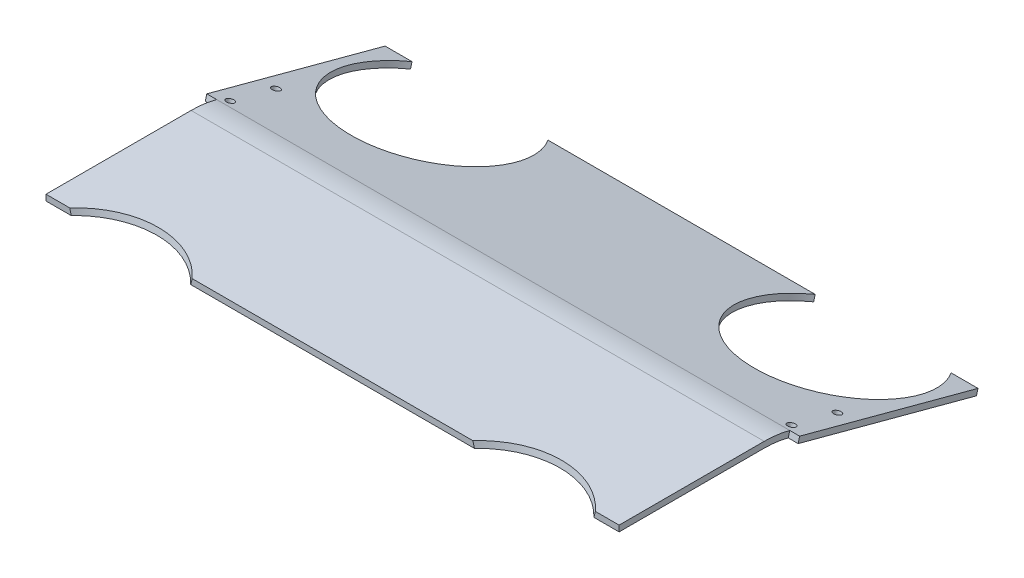
ISO-10303-21;
HEADER;
FILE_DESCRIPTION(('STEP AP214'),'2;1');
FILE_NAME('part.step','',(''),(''),'','','');
FILE_SCHEMA(('AUTOMOTIVE_DESIGN { 1 0 10303 214 1 1 1 1 }'));
ENDSEC;
DATA;
#1=APPLICATION_CONTEXT('core data for automotive mechanical design processes');
#2=APPLICATION_PROTOCOL_DEFINITION('international standard','automotive_design',2000,#1);
#3=PRODUCT_CONTEXT('',#1,'mechanical');
#4=PRODUCT('Part','Part','',(#3));
#5=PRODUCT_RELATED_PRODUCT_CATEGORY('part','',(#4));
#6=PRODUCT_DEFINITION_FORMATION('','',#4);
#7=PRODUCT_DEFINITION_CONTEXT('part definition',#1,'design');
#8=PRODUCT_DEFINITION('design','',#6,#7);
#9=PRODUCT_DEFINITION_SHAPE('','',#8);
#10=(LENGTH_UNIT() NAMED_UNIT(*) SI_UNIT(.MILLI.,.METRE.));
#11=(NAMED_UNIT(*) PLANE_ANGLE_UNIT() SI_UNIT($,.RADIAN.));
#12=(NAMED_UNIT(*) SI_UNIT($,.STERADIAN.) SOLID_ANGLE_UNIT());
#13=UNCERTAINTY_MEASURE_WITH_UNIT(LENGTH_MEASURE(1.E-05),#10,'distance_accuracy_value','');
#14=(GEOMETRIC_REPRESENTATION_CONTEXT(3) GLOBAL_UNCERTAINTY_ASSIGNED_CONTEXT((#13)) GLOBAL_UNIT_ASSIGNED_CONTEXT((#10,
#11,#12)) REPRESENTATION_CONTEXT('',''));
#15=CARTESIAN_POINT('',(0.,0.,0.));
#16=DIRECTION('',(0.,0.,1.));
#17=DIRECTION('',(1.,0.,0.));
#18=AXIS2_PLACEMENT_3D('',#15,#16,#17);
#19=CARTESIAN_POINT('',(300.,0.,0.));
#20=DIRECTION('',(0.,0.,-1.));
#21=DIRECTION('',(-1.,0.,0.));
#22=AXIS2_PLACEMENT_3D('',#19,#20,#21);
#23=PLANE('',#22);
#24=DIRECTION('',(-1.,0.,0.));
#25=VECTOR('',#24,1.);
#26=CARTESIAN_POINT('',(300.,0.,0.));
#27=LINE('',#26,#25);
#28=CARTESIAN_POINT('',(221.010392932059,0.,0.));
#29=VERTEX_POINT('',#28);
#30=CARTESIAN_POINT('',(78.9896070679405,0.,0.));
#31=VERTEX_POINT('',#30);
#32=EDGE_CURVE('E229',#29,#31,#27,.T.);
#33=ORIENTED_EDGE('',*,*,#32,.T.);
#34=CARTESIAN_POINT('',(48.,112.372956407092,0.));
#35=DIRECTION('',(0.,0.,-1.));
#36=DIRECTION('',(0.,1.,0.));
#37=AXIS2_PLACEMENT_3D('',#34,#35,#36);
#38=ELLIPSE('',#37,164.207390469141,42.5);
#39=CARTESIAN_POINT('',(78.242147677733,-3.,0.));
#40=VERTEX_POINT('',#39);
#41=EDGE_CURVE('E237',#31,#40,#38,.T.);
#42=ORIENTED_EDGE('',*,*,#41,.T.);
#43=DIRECTION('',(-1.,0.,0.));
#44=VECTOR('',#43,1.);
#45=CARTESIAN_POINT('',(300.,-3.,0.));
#46=LINE('',#45,#44);
#47=CARTESIAN_POINT('',(221.757852322267,-3.,0.));
#48=VERTEX_POINT('',#47);
#49=EDGE_CURVE('E213',#48,#40,#46,.T.);
#50=ORIENTED_EDGE('',*,*,#49,.F.);
#51=CARTESIAN_POINT('',(252.,112.372956407092,0.));
#52=DIRECTION('',(0.,0.,-1.));
#53=DIRECTION('',(0.,1.,0.));
#54=AXIS2_PLACEMENT_3D('',#51,#52,#53);
#55=ELLIPSE('',#54,164.207390469141,42.5);
#56=EDGE_CURVE('E239',#48,#29,#55,.T.);
#57=ORIENTED_EDGE('',*,*,#56,.T.);
#58=EDGE_LOOP('',(#33,#42,#50,#57));
#59=FACE_BOUND('',#58,.T.);
#60=ADVANCED_FACE('F38',(#59),#23,.F.);
#61=CARTESIAN_POINT('',(295.,-3.,0.));
#62=VERTEX_POINT('',#61);
#63=CARTESIAN_POINT('',(282.242147677733,-3.,0.));
#64=VERTEX_POINT('',#63);
#65=EDGE_CURVE('E214',#62,#64,#46,.T.);
#66=ORIENTED_EDGE('',*,*,#65,.F.);
#67=DIRECTION('',(0.,1.,0.));
#68=VECTOR('',#67,1.);
#69=CARTESIAN_POINT('',(295.,0.,0.));
#70=LINE('',#69,#68);
#71=CARTESIAN_POINT('',(295.,0.,0.));
#72=VERTEX_POINT('',#71);
#73=EDGE_CURVE('E280',#62,#72,#70,.T.);
#74=ORIENTED_EDGE('',*,*,#73,.T.);
#75=CARTESIAN_POINT('',(282.98960706794,0.,0.));
#76=VERTEX_POINT('',#75);
#77=EDGE_CURVE('E240',#72,#76,#27,.T.);
#78=ORIENTED_EDGE('',*,*,#77,.T.);
#79=EDGE_CURVE('E300',#76,#64,#55,.T.);
#80=ORIENTED_EDGE('',*,*,#79,.T.);
#81=EDGE_LOOP('',(#66,#74,#78,#80));
#82=FACE_BOUND('',#81,.T.);
#83=ADVANCED_FACE('F390',(#82),#23,.F.);
#84=CARTESIAN_POINT('',(300.,-25.8819045102521,-176.592582628907));
#85=DIRECTION('',(0.,0.258819045102508,0.965925826289072));
#86=DIRECTION('',(0.,-0.965925826289072,0.258819045102508));
#87=AXIS2_PLACEMENT_3D('',#84,#85,#86);
#88=PLANE('',#87);
#89=DIRECTION('',(-1.,0.,0.));
#90=VECTOR('',#89,1.);
#91=CARTESIAN_POINT('',(300.,-28.7796819891194,-175.816125493599));
#92=LINE('',#91,#90);
#93=CARTESIAN_POINT('',(300.,-28.7796819891194,-175.816125493599));
#94=VERTEX_POINT('',#93);
#95=CARTESIAN_POINT('',(286.369317712169,-28.7796819891194,-175.816125493599));
#96=VERTEX_POINT('',#95);
#97=EDGE_CURVE('E201',#94,#96,#92,.T.);
#98=ORIENTED_EDGE('',*,*,#97,.T.);
#99=DIRECTION('',(0.,0.965925826289068,-0.258819045102522));
#100=VECTOR('',#99,1.);
#101=CARTESIAN_POINT('',(286.369317712168,-72.7337133625192,-164.038678283005));
#102=LINE('',#101,#100);
#103=CARTESIAN_POINT('',(286.369317712169,-25.8819045102522,-176.592582628907));
#104=VERTEX_POINT('',#103);
#105=EDGE_CURVE('E252',#96,#104,#102,.T.);
#106=ORIENTED_EDGE('',*,*,#105,.T.);
#107=DIRECTION('',(-1.,0.,0.));
#108=VECTOR('',#107,1.);
#109=CARTESIAN_POINT('',(300.,-25.8819045102521,-176.592582628907));
#110=LINE('',#109,#108);
#111=CARTESIAN_POINT('',(300.,-25.8819045102521,-176.592582628907));
#112=VERTEX_POINT('',#111);
#113=EDGE_CURVE('E195',#112,#104,#110,.T.);
#114=ORIENTED_EDGE('',*,*,#113,.F.);
#115=DIRECTION('',(0.,0.965925826289072,-0.258819045102508));
#116=VECTOR('',#115,1.);
#117=CARTESIAN_POINT('',(300.,-25.8819045102521,-176.592582628907));
#118=LINE('',#117,#116);
#119=EDGE_CURVE('E180',#94,#112,#118,.T.);
#120=ORIENTED_EDGE('',*,*,#119,.F.);
#121=EDGE_LOOP('',(#98,#106,#114,#120));
#122=FACE_BOUND('',#121,.T.);
#123=ADVANCED_FACE('F382',(#122),#88,.F.);
#124=CARTESIAN_POINT('',(217.630682287831,-25.8819045102521,-176.592582628907));
#125=VERTEX_POINT('',#124);
#126=CARTESIAN_POINT('',(82.3693177121688,-25.8819045102522,-176.592582628907));
#127=VERTEX_POINT('',#126);
#128=EDGE_CURVE('E193',#125,#127,#110,.T.);
#129=ORIENTED_EDGE('',*,*,#128,.F.);
#130=DIRECTION('',(0.,0.965925826289068,-0.258819045102522));
#131=VECTOR('',#130,1.);
#132=CARTESIAN_POINT('',(217.630682287832,-72.7337133625192,-164.038678283005));
#133=LINE('',#132,#131);
#134=CARTESIAN_POINT('',(217.630682287832,-28.7796819891194,-175.8161254936));
#135=VERTEX_POINT('',#134);
#136=EDGE_CURVE('E60',#125,#135,#133,.F.);
#137=ORIENTED_EDGE('',*,*,#136,.T.);
#138=CARTESIAN_POINT('',(82.3693177121688,-28.7796819891194,-175.816125493599));
#139=VERTEX_POINT('',#138);
#140=EDGE_CURVE('E205',#135,#139,#92,.T.);
#141=ORIENTED_EDGE('',*,*,#140,.T.);
#142=DIRECTION('',(0.,0.965925826289068,-0.258819045102522));
#143=VECTOR('',#142,1.);
#144=CARTESIAN_POINT('',(82.3693177121683,-72.7337133625192,-164.038678283005));
#145=LINE('',#144,#143);
#146=EDGE_CURVE('E262',#139,#127,#145,.T.);
#147=ORIENTED_EDGE('',*,*,#146,.T.);
#148=EDGE_LOOP('',(#129,#137,#141,#147));
#149=FACE_BOUND('',#148,.T.);
#150=ADVANCED_FACE('F380',(#149),#88,.F.);
#151=CARTESIAN_POINT('',(17.7578523222671,-3.,0.));
#152=VERTEX_POINT('',#151);
#153=CARTESIAN_POINT('',(5.,-3.,0.));
#154=VERTEX_POINT('',#153);
#155=EDGE_CURVE('E210',#152,#154,#46,.T.);
#156=ORIENTED_EDGE('',*,*,#155,.F.);
#157=CARTESIAN_POINT('',(17.0103929320596,0.,0.));
#158=VERTEX_POINT('',#157);
#159=EDGE_CURVE('E272',#152,#158,#38,.T.);
#160=ORIENTED_EDGE('',*,*,#159,.T.);
#161=CARTESIAN_POINT('',(5.,0.,0.));
#162=VERTEX_POINT('',#161);
#163=EDGE_CURVE('E184',#158,#162,#27,.T.);
#164=ORIENTED_EDGE('',*,*,#163,.T.);
#165=DIRECTION('',(0.,-1.,0.));
#166=VECTOR('',#165,1.);
#167=CARTESIAN_POINT('',(5.,0.,0.));
#168=LINE('',#167,#166);
#169=EDGE_CURVE('E291',#162,#154,#168,.T.);
#170=ORIENTED_EDGE('',*,*,#169,.T.);
#171=EDGE_LOOP('',(#156,#160,#164,#170));
#172=FACE_BOUND('',#171,.T.);
#173=ADVANCED_FACE('F40',(#172),#23,.F.);
#174=CARTESIAN_POINT('',(300.,-3.,0.));
#175=DIRECTION('',(0.,1.,0.));
#176=DIRECTION('',(0.,0.,1.));
#177=AXIS2_PLACEMENT_3D('',#174,#175,#176);
#178=PLANE('',#177);
#179=ORIENTED_EDGE('',*,*,#49,.T.);
#180=CARTESIAN_POINT('',(48.,-3.,30.9140904976715));
#181=DIRECTION('',(0.,1.,0.));
#182=DIRECTION('',(0.,0.,-1.));
#183=AXIS2_PLACEMENT_3D('',#180,#181,#182);
#184=ELLIPSE('',#183,43.9992376674285,42.5);
#185=EDGE_CURVE('E269',#40,#152,#184,.T.);
#186=ORIENTED_EDGE('',*,*,#185,.T.);
#187=ORIENTED_EDGE('',*,*,#155,.T.);
#188=DIRECTION('',(0.,0.,-1.));
#189=VECTOR('',#188,1.);
#190=CARTESIAN_POINT('',(5.,-3.,0.));
#191=LINE('',#190,#189);
#192=CARTESIAN_POINT('',(5.,-3.,-73.4173751206302));
#193=VERTEX_POINT('',#192);
#194=EDGE_CURVE('E288',#154,#193,#191,.T.);
#195=ORIENTED_EDGE('',*,*,#194,.T.);
#196=DIRECTION('',(-1.,0.,0.));
#197=VECTOR('',#196,1.);
#198=CARTESIAN_POINT('',(300.,-3.00000000000001,-73.4173751206302));
#199=LINE('',#198,#197);
#200=CARTESIAN_POINT('',(295.,-3.,-73.4173751206302));
#201=VERTEX_POINT('',#200);
#202=EDGE_CURVE('E207',#201,#193,#199,.T.);
#203=ORIENTED_EDGE('',*,*,#202,.F.);
#204=DIRECTION('',(0.,0.,1.));
#205=VECTOR('',#204,1.);
#206=CARTESIAN_POINT('',(295.,-3.,0.));
#207=LINE('',#206,#205);
#208=EDGE_CURVE('E277',#201,#62,#207,.T.);
#209=ORIENTED_EDGE('',*,*,#208,.T.);
#210=ORIENTED_EDGE('',*,*,#65,.T.);
#211=CARTESIAN_POINT('',(252.,-3.,30.9140904976715));
#212=DIRECTION('',(0.,1.,0.));
#213=DIRECTION('',(0.,0.,-1.));
#214=AXIS2_PLACEMENT_3D('',#211,#212,#213);
#215=ELLIPSE('',#214,43.9992376674285,42.5);
#216=EDGE_CURVE('E297',#64,#48,#215,.T.);
#217=ORIENTED_EDGE('',*,*,#216,.T.);
#218=EDGE_LOOP('',(#179,#186,#187,#195,#203,#209,#210,#217));
#219=FACE_BOUND('',#218,.T.);
#220=ADVANCED_FACE('F388',(#219),#178,.F.);
#221=CARTESIAN_POINT('',(300.,-50.,-73.4173751206302));
#222=DIRECTION('',(-1.,0.,0.));
#223=DIRECTION('',(0.,0.,1.));
#224=AXIS2_PLACEMENT_3D('',#221,#222,#223);
#225=CYLINDRICAL_SURFACE('',#224,47.);
#226=DIRECTION('',(-1.,0.,0.));
#227=VECTOR('',#226,1.);
#228=CARTESIAN_POINT('',(300.,-4.60148616441381,-85.5818702404487));
#229=LINE('',#228,#227);
#230=CARTESIAN_POINT('',(295.,-4.60148616441382,-85.5818702404487));
#231=VERTEX_POINT('',#230);
#232=CARTESIAN_POINT('',(5.,-4.60148616441381,-85.5818702404487));
#233=VERTEX_POINT('',#232);
#234=EDGE_CURVE('E204',#231,#233,#229,.T.);
#235=ORIENTED_EDGE('',*,*,#234,.F.);
#236=CARTESIAN_POINT('',(295.,-50.,-73.4173751206302));
#237=DIRECTION('',(-1.,0.,0.));
#238=DIRECTION('',(0.,0.,1.));
#239=AXIS2_PLACEMENT_3D('',#236,#237,#238);
#240=CIRCLE('',#239,47.);
#241=EDGE_CURVE('E274',#231,#201,#240,.F.);
#242=ORIENTED_EDGE('',*,*,#241,.T.);
#243=ORIENTED_EDGE('',*,*,#202,.T.);
#244=CARTESIAN_POINT('',(5.,-50.,-73.4173751206302));
#245=DIRECTION('',(1.,0.,0.));
#246=DIRECTION('',(0.,0.,-1.));
#247=AXIS2_PLACEMENT_3D('',#244,#245,#246);
#248=CIRCLE('',#247,47.);
#249=EDGE_CURVE('E285',#193,#233,#248,.F.);
#250=ORIENTED_EDGE('',*,*,#249,.T.);
#251=EDGE_LOOP('',(#235,#242,#243,#250));
#252=FACE_BOUND('',#251,.T.);
#253=ADVANCED_FACE('F360',(#252),#225,.F.);
#254=CARTESIAN_POINT('',(300.,-4.60148616441381,-85.5818702404487));
#255=DIRECTION('',(0.,0.965925826289068,-0.258819045102521));
#256=DIRECTION('',(0.,0.258819045102521,0.965925826289068));
#257=AXIS2_PLACEMENT_3D('',#254,#255,#256);
#258=PLANE('',#257);
#259=CARTESIAN_POINT('',(8.00000000000001,-11.8484194272844,-112.627793376543));
#260=DIRECTION('',(0.,0.965925826289068,-0.258819045102521));
#261=DIRECTION('',(0.,0.258819045102521,0.965925826289068));
#262=AXIS2_PLACEMENT_3D('',#259,#260,#261);
#263=CIRCLE('',#262,2.);
#264=CARTESIAN_POINT('',(8.00000000000001,-11.3307813370794,-110.695941723964));
#265=VERTEX_POINT('',#264);
#266=EDGE_CURVE('E314',#265,#265,#263,.T.);
#267=ORIENTED_EDGE('',*,*,#266,.T.);
#268=EDGE_LOOP('',(#267));
#269=FACE_BOUND('',#268,.T.);
#270=CARTESIAN_POINT('',(292.,-5.6367623448239,-89.445573545605));
#271=DIRECTION('',(0.,0.965925826289068,-0.258819045102521));
#272=DIRECTION('',(0.,0.258819045102521,0.965925826289068));
#273=AXIS2_PLACEMENT_3D('',#270,#271,#272);
#274=CIRCLE('',#273,2.);
#275=CARTESIAN_POINT('',(292.,-5.11912425461886,-87.5137218930269));
#276=VERTEX_POINT('',#275);
#277=EDGE_CURVE('E317',#276,#276,#274,.T.);
#278=ORIENTED_EDGE('',*,*,#277,.T.);
#279=EDGE_LOOP('',(#278));
#280=FACE_BOUND('',#279,.T.);
#281=CARTESIAN_POINT('',(292.,-11.8484194272844,-112.627793376543));
#282=DIRECTION('',(0.,0.965925826289068,-0.258819045102521));
#283=DIRECTION('',(0.,0.258819045102521,0.965925826289068));
#284=AXIS2_PLACEMENT_3D('',#281,#282,#283);
#285=CIRCLE('',#284,2.);
#286=CARTESIAN_POINT('',(292.,-11.3307813370794,-110.695941723965));
#287=VERTEX_POINT('',#286);
#288=EDGE_CURVE('E320',#287,#287,#285,.T.);
#289=ORIENTED_EDGE('',*,*,#288,.T.);
#290=EDGE_LOOP('',(#289));
#291=FACE_BOUND('',#290,.T.);
#292=CARTESIAN_POINT('',(8.00000000000001,-5.63676234482389,-89.4455735456049));
#293=DIRECTION('',(0.,0.965925826289068,-0.258819045102521));
#294=DIRECTION('',(0.,0.258819045102521,0.965925826289068));
#295=AXIS2_PLACEMENT_3D('',#292,#293,#294);
#296=CIRCLE('',#295,2.);
#297=CARTESIAN_POINT('',(8.00000000000001,-5.11912425461885,-87.5137218930268));
#298=VERTEX_POINT('',#297);
#299=EDGE_CURVE('E323',#298,#298,#296,.T.);
#300=ORIENTED_EDGE('',*,*,#299,.T.);
#301=EDGE_LOOP('',(#300));
#302=FACE_BOUND('',#301,.T.);
#303=ORIENTED_EDGE('',*,*,#140,.F.);
#304=CARTESIAN_POINT('',(252.,-22.3092058615563,-151.667979836373));
#305=DIRECTION('',(0.,0.965925826289068,-0.258819045102521));
#306=DIRECTION('',(0.,0.258819045102521,0.965925826289068));
#307=AXIS2_PLACEMENT_3D('',#304,#305,#306);
#308=CIRCLE('',#307,42.5);
#309=EDGE_CURVE('E258',#135,#96,#308,.T.);
#310=ORIENTED_EDGE('',*,*,#309,.T.);
#311=ORIENTED_EDGE('',*,*,#97,.F.);
#312=DIRECTION('',(0.,-0.258819045102521,-0.965925826289068));
#313=VECTOR('',#312,1.);
#314=CARTESIAN_POINT('',(300.,-4.60148616441381,-85.5818702404487));
#315=LINE('',#314,#313);
#316=CARTESIAN_POINT('',(300.,-4.60148616441381,-85.5818702404487));
#317=VERTEX_POINT('',#316);
#318=EDGE_CURVE('E246',#317,#94,#315,.T.);
#319=ORIENTED_EDGE('',*,*,#318,.F.);
#320=EDGE_CURVE('E170',#317,#231,#229,.T.);
#321=ORIENTED_EDGE('',*,*,#320,.T.);
#322=ORIENTED_EDGE('',*,*,#234,.T.);
#323=DIRECTION('',(-1.,0.,0.));
#324=VECTOR('',#323,1.);
#325=CARTESIAN_POINT('',(300.,-4.60148616441381,-85.5818702404487));
#326=LINE('',#325,#324);
#327=CARTESIAN_POINT('',(0.,-4.6014861644138,-85.5818702404487));
#328=VERTEX_POINT('',#327);
#329=EDGE_CURVE('E302',#233,#328,#326,.T.);
#330=ORIENTED_EDGE('',*,*,#329,.T.);
#331=DIRECTION('',(0.,-0.258819045102521,-0.965925826289068));
#332=VECTOR('',#331,1.);
#333=CARTESIAN_POINT('',(0.,-4.60148616441381,-85.5818702404487));
#334=LINE('',#333,#332);
#335=CARTESIAN_POINT('',(0.,-28.7796819891194,-175.816125493599));
#336=VERTEX_POINT('',#335);
#337=EDGE_CURVE('E250',#328,#336,#334,.T.);
#338=ORIENTED_EDGE('',*,*,#337,.T.);
#339=CARTESIAN_POINT('',(13.6306822878317,-28.7796819891194,-175.8161254936));
#340=VERTEX_POINT('',#339);
#341=EDGE_CURVE('E200',#340,#336,#92,.T.);
#342=ORIENTED_EDGE('',*,*,#341,.F.);
#343=CARTESIAN_POINT('',(48.,-22.3092058615563,-151.667979836373));
#344=DIRECTION('',(0.,0.965925826289068,-0.258819045102521));
#345=DIRECTION('',(0.,0.258819045102521,0.965925826289068));
#346=AXIS2_PLACEMENT_3D('',#343,#344,#345);
#347=CIRCLE('',#346,42.5);
#348=EDGE_CURVE('E265',#340,#139,#347,.T.);
#349=ORIENTED_EDGE('',*,*,#348,.T.);
#350=EDGE_LOOP('',(#303,#310,#311,#319,#321,#322,#330,#338,#342,#349));
#351=FACE_BOUND('',#350,.T.);
#352=ADVANCED_FACE('F357',(#269,#280,#291,#302,#351),#258,.F.);
#353=CARTESIAN_POINT('',(13.6306822878312,-25.8819045102521,-176.592582628907));
#354=VERTEX_POINT('',#353);
#355=CARTESIAN_POINT('',(0.,-25.8819045102521,-176.592582628907));
#356=VERTEX_POINT('',#355);
#357=EDGE_CURVE('E191',#354,#356,#110,.T.);
#358=ORIENTED_EDGE('',*,*,#357,.F.);
#359=DIRECTION('',(0.,0.965925826289068,-0.258819045102522));
#360=VECTOR('',#359,1.);
#361=CARTESIAN_POINT('',(13.6306822878317,-72.7337133625192,-164.038678283005));
#362=LINE('',#361,#360);
#363=EDGE_CURVE('E53',#354,#340,#362,.F.);
#364=ORIENTED_EDGE('',*,*,#363,.T.);
#365=ORIENTED_EDGE('',*,*,#341,.T.);
#366=DIRECTION('',(0.,0.965925826289072,-0.258819045102508));
#367=VECTOR('',#366,1.);
#368=CARTESIAN_POINT('',(0.,-25.8819045102521,-176.592582628907));
#369=LINE('',#368,#367);
#370=EDGE_CURVE('E247',#336,#356,#369,.T.);
#371=ORIENTED_EDGE('',*,*,#370,.T.);
#372=EDGE_LOOP('',(#358,#364,#365,#371));
#373=FACE_BOUND('',#372,.T.);
#374=ADVANCED_FACE('F345',(#373),#88,.F.);
#375=CARTESIAN_POINT('',(300.,-1.70370868554658,-86.3583273757563));
#376=DIRECTION('',(0.,-0.965925826289068,0.258819045102522));
#377=DIRECTION('',(0.,-0.258819045102522,-0.965925826289068));
#378=AXIS2_PLACEMENT_3D('',#375,#376,#377);
#379=PLANE('',#378);
#380=CARTESIAN_POINT('',(8.00000000000001,-8.9506419484172,-113.40425051185));
#381=DIRECTION('',(0.,0.965925826289068,-0.258819045102522));
#382=DIRECTION('',(0.,0.258819045102522,0.965925826289068));
#383=AXIS2_PLACEMENT_3D('',#380,#381,#382);
#384=CIRCLE('',#383,2.);
#385=CARTESIAN_POINT('',(8.00000000000001,-8.43300385821216,-111.472398859272));
#386=VERTEX_POINT('',#385);
#387=EDGE_CURVE('E329',#386,#386,#384,.T.);
#388=ORIENTED_EDGE('',*,*,#387,.F.);
#389=EDGE_LOOP('',(#388));
#390=FACE_BOUND('',#389,.T.);
#391=CARTESIAN_POINT('',(292.,-2.73898486595669,-90.2220306809126));
#392=DIRECTION('',(0.,0.965925826289068,-0.258819045102522));
#393=DIRECTION('',(0.,-0.258819045102522,-0.965925826289068));
#394=AXIS2_PLACEMENT_3D('',#391,#392,#393);
#395=CIRCLE('',#394,2.);
#396=CARTESIAN_POINT('',(292.,-3.25662295616173,-92.1538823334907));
#397=VERTEX_POINT('',#396);
#398=EDGE_CURVE('E330',#397,#397,#395,.T.);
#399=ORIENTED_EDGE('',*,*,#398,.F.);
#400=EDGE_LOOP('',(#399));
#401=FACE_BOUND('',#400,.T.);
#402=CARTESIAN_POINT('',(292.,-8.95064194841721,-113.40425051185));
#403=DIRECTION('',(0.,0.965925826289068,-0.258819045102522));
#404=DIRECTION('',(0.,-0.258819045102522,-0.965925826289068));
#405=AXIS2_PLACEMENT_3D('',#402,#403,#404);
#406=CIRCLE('',#405,2.);
#407=CARTESIAN_POINT('',(292.,-9.46828003862225,-115.336102164428));
#408=VERTEX_POINT('',#407);
#409=EDGE_CURVE('E333',#408,#408,#406,.T.);
#410=ORIENTED_EDGE('',*,*,#409,.F.);
#411=EDGE_LOOP('',(#410));
#412=FACE_BOUND('',#411,.T.);
#413=CARTESIAN_POINT('',(8.00000000000001,-2.73898486595668,-90.2220306809125));
#414=DIRECTION('',(0.,0.965925826289068,-0.258819045102522));
#415=DIRECTION('',(0.,0.258819045102522,0.965925826289068));
#416=AXIS2_PLACEMENT_3D('',#413,#414,#415);
#417=CIRCLE('',#416,2.);
#418=CARTESIAN_POINT('',(8.00000000000001,-2.22134677575163,-88.2901790283344));
#419=VERTEX_POINT('',#418);
#420=EDGE_CURVE('E326',#419,#419,#417,.T.);
#421=ORIENTED_EDGE('',*,*,#420,.F.);
#422=EDGE_LOOP('',(#421));
#423=FACE_BOUND('',#422,.T.);
#424=ORIENTED_EDGE('',*,*,#113,.T.);
#425=CARTESIAN_POINT('',(252.,-19.4114283826891,-152.44443697168));
#426=DIRECTION('',(0.,0.965925826289068,-0.258819045102522));
#427=DIRECTION('',(0.,-0.258819045102522,-0.965925826289068));
#428=AXIS2_PLACEMENT_3D('',#425,#426,#427);
#429=CIRCLE('',#428,42.5);
#430=EDGE_CURVE('E305',#125,#104,#429,.T.);
#431=ORIENTED_EDGE('',*,*,#430,.F.);
#432=ORIENTED_EDGE('',*,*,#128,.T.);
#433=CARTESIAN_POINT('',(48.,-19.4114283826891,-152.44443697168));
#434=DIRECTION('',(0.,-0.965925826289068,0.258819045102522));
#435=DIRECTION('',(0.,-0.258819045102522,-0.965925826289068));
#436=AXIS2_PLACEMENT_3D('',#433,#434,#435);
#437=CIRCLE('',#436,42.5);
#438=EDGE_CURVE('E11',#127,#354,#437,.T.);
#439=ORIENTED_EDGE('',*,*,#438,.T.);
#440=ORIENTED_EDGE('',*,*,#357,.T.);
#441=DIRECTION('',(0.,0.258819045102522,0.965925826289068));
#442=VECTOR('',#441,1.);
#443=CARTESIAN_POINT('',(0.,-1.70370868554658,-86.3583273757563));
#444=LINE('',#443,#442);
#445=CARTESIAN_POINT('',(0.,-1.70370868554659,-86.3583273757563));
#446=VERTEX_POINT('',#445);
#447=EDGE_CURVE('E243',#356,#446,#444,.T.);
#448=ORIENTED_EDGE('',*,*,#447,.T.);
#449=DIRECTION('',(-1.,0.,0.));
#450=VECTOR('',#449,1.);
#451=CARTESIAN_POINT('',(0.,-1.70370868554659,-86.3583273757563));
#452=LINE('',#451,#450);
#453=CARTESIAN_POINT('',(5.,-1.70370868554659,-86.3583273757563));
#454=VERTEX_POINT('',#453);
#455=EDGE_CURVE('E309',#454,#446,#452,.T.);
#456=ORIENTED_EDGE('',*,*,#455,.F.);
#457=DIRECTION('',(-1.,0.,0.));
#458=VECTOR('',#457,1.);
#459=CARTESIAN_POINT('',(300.,-1.70370868554659,-86.3583273757563));
#460=LINE('',#459,#458);
#461=CARTESIAN_POINT('',(295.,-1.70370868554659,-86.3583273757563));
#462=VERTEX_POINT('',#461);
#463=EDGE_CURVE('E190',#462,#454,#460,.T.);
#464=ORIENTED_EDGE('',*,*,#463,.F.);
#465=CARTESIAN_POINT('',(300.,-1.70370868554659,-86.3583273757563));
#466=VERTEX_POINT('',#465);
#467=EDGE_CURVE('E167',#466,#462,#460,.T.);
#468=ORIENTED_EDGE('',*,*,#467,.F.);
#469=DIRECTION('',(0.,0.258819045102522,0.965925826289068));
#470=VECTOR('',#469,1.);
#471=CARTESIAN_POINT('',(300.,-1.70370868554658,-86.3583273757563));
#472=LINE('',#471,#470);
#473=EDGE_CURVE('E177',#112,#466,#472,.T.);
#474=ORIENTED_EDGE('',*,*,#473,.F.);
#475=EDGE_LOOP('',(#424,#431,#432,#439,#440,#448,#456,#464,#468,#474));
#476=FACE_BOUND('',#475,.T.);
#477=ADVANCED_FACE('F187',(#390,#401,#412,#423,#476),#379,.F.);
#478=CARTESIAN_POINT('',(300.,-50.,-73.4173751206302));
#479=DIRECTION('',(-1.,0.,0.));
#480=DIRECTION('',(0.,0.,1.));
#481=AXIS2_PLACEMENT_3D('',#478,#479,#480);
#482=CYLINDRICAL_SURFACE('',#481,50.);
#483=DIRECTION('',(-1.,0.,0.));
#484=VECTOR('',#483,1.);
#485=CARTESIAN_POINT('',(300.,0.,-73.4173751206302));
#486=LINE('',#485,#484);
#487=CARTESIAN_POINT('',(295.,0.,-73.4173751206302));
#488=VERTEX_POINT('',#487);
#489=CARTESIAN_POINT('',(5.,0.,-73.4173751206302));
#490=VERTEX_POINT('',#489);
#491=EDGE_CURVE('E196',#488,#490,#486,.T.);
#492=ORIENTED_EDGE('',*,*,#491,.F.);
#493=CARTESIAN_POINT('',(295.,-50.,-73.4173751206302));
#494=DIRECTION('',(-1.,0.,0.));
#495=DIRECTION('',(0.,0.,1.));
#496=AXIS2_PLACEMENT_3D('',#493,#494,#495);
#497=CIRCLE('',#496,50.);
#498=EDGE_CURVE('E283',#488,#462,#497,.T.);
#499=ORIENTED_EDGE('',*,*,#498,.T.);
#500=ORIENTED_EDGE('',*,*,#463,.T.);
#501=CARTESIAN_POINT('',(5.,-50.,-73.4173751206302));
#502=DIRECTION('',(1.,0.,0.));
#503=DIRECTION('',(0.,0.,-1.));
#504=AXIS2_PLACEMENT_3D('',#501,#502,#503);
#505=CIRCLE('',#504,50.);
#506=EDGE_CURVE('E294',#454,#490,#505,.T.);
#507=ORIENTED_EDGE('',*,*,#506,.T.);
#508=EDGE_LOOP('',(#492,#499,#500,#507));
#509=FACE_BOUND('',#508,.T.);
#510=ADVANCED_FACE('F344',(#509),#482,.T.);
#511=CARTESIAN_POINT('',(300.,0.,0.));
#512=DIRECTION('',(0.,-1.,0.));
#513=DIRECTION('',(0.,0.,-1.));
#514=AXIS2_PLACEMENT_3D('',#511,#512,#513);
#515=PLANE('',#514);
#516=ORIENTED_EDGE('',*,*,#163,.F.);
#517=CARTESIAN_POINT('',(48.,0.,30.1102429203782));
#518=DIRECTION('',(0.,-1.,0.));
#519=DIRECTION('',(0.,0.,-1.));
#520=AXIS2_PLACEMENT_3D('',#517,#518,#519);
#521=ELLIPSE('',#520,43.9992376674285,42.5);
#522=EDGE_CURVE('E46',#158,#31,#521,.T.);
#523=ORIENTED_EDGE('',*,*,#522,.T.);
#524=ORIENTED_EDGE('',*,*,#32,.F.);
#525=CARTESIAN_POINT('',(252.,0.,30.1102429203782));
#526=DIRECTION('',(0.,-1.,0.));
#527=DIRECTION('',(0.,0.,-1.));
#528=AXIS2_PLACEMENT_3D('',#525,#526,#527);
#529=ELLIPSE('',#528,43.9992376674285,42.5);
#530=EDGE_CURVE('E173',#29,#76,#529,.T.);
#531=ORIENTED_EDGE('',*,*,#530,.T.);
#532=ORIENTED_EDGE('',*,*,#77,.F.);
#533=DIRECTION('',(0.,0.,-1.));
#534=VECTOR('',#533,1.);
#535=CARTESIAN_POINT('',(295.,0.,0.));
#536=LINE('',#535,#534);
#537=EDGE_CURVE('E221',#72,#488,#536,.T.);
#538=ORIENTED_EDGE('',*,*,#537,.T.);
#539=ORIENTED_EDGE('',*,*,#491,.T.);
#540=DIRECTION('',(0.,0.,1.));
#541=VECTOR('',#540,1.);
#542=CARTESIAN_POINT('',(5.,0.,0.));
#543=LINE('',#542,#541);
#544=EDGE_CURVE('E218',#490,#162,#543,.T.);
#545=ORIENTED_EDGE('',*,*,#544,.T.);
#546=EDGE_LOOP('',(#516,#523,#524,#531,#532,#538,#539,#545));
#547=FACE_BOUND('',#546,.T.);
#548=ADVANCED_FACE('F228',(#547),#515,.F.);
#549=CARTESIAN_POINT('',(300.,-50.,-73.4173751206302));
#550=DIRECTION('',(-1.,0.,0.));
#551=DIRECTION('',(0.,0.,1.));
#552=AXIS2_PLACEMENT_3D('',#549,#550,#551);
#553=PLANE('',#552);
#554=ORIENTED_EDGE('',*,*,#473,.T.);
#555=DIRECTION('',(0.,-0.965925826289068,0.258819045102522));
#556=VECTOR('',#555,1.);
#557=CARTESIAN_POINT('',(300.,-50.,-73.4173751206302));
#558=LINE('',#557,#556);
#559=EDGE_CURVE('E162',#466,#317,#558,.T.);
#560=ORIENTED_EDGE('',*,*,#559,.T.);
#561=ORIENTED_EDGE('',*,*,#318,.T.);
#562=ORIENTED_EDGE('',*,*,#119,.T.);
#563=EDGE_LOOP('',(#554,#560,#561,#562));
#564=FACE_BOUND('',#563,.T.);
#565=ADVANCED_FACE('F178',(#564),#553,.F.);
#566=CARTESIAN_POINT('',(0.,-50.,-73.4173751206302));
#567=DIRECTION('',(-1.,0.,0.));
#568=DIRECTION('',(0.,0.,1.));
#569=AXIS2_PLACEMENT_3D('',#566,#567,#568);
#570=PLANE('',#569);
#571=DIRECTION('',(0.,-0.965925826289068,0.258819045102522));
#572=VECTOR('',#571,1.);
#573=CARTESIAN_POINT('',(0.,-50.,-73.4173751206302));
#574=LINE('',#573,#572);
#575=EDGE_CURVE('E174',#446,#328,#574,.T.);
#576=ORIENTED_EDGE('',*,*,#575,.F.);
#577=ORIENTED_EDGE('',*,*,#447,.F.);
#578=ORIENTED_EDGE('',*,*,#370,.F.);
#579=ORIENTED_EDGE('',*,*,#337,.F.);
#580=EDGE_LOOP('',(#576,#577,#578,#579));
#581=FACE_BOUND('',#580,.T.);
#582=ADVANCED_FACE('F376',(#581),#570,.T.);
#583=CARTESIAN_POINT('',(5.,-48.5555175378137,-73.8044230298539));
#584=DIRECTION('',(1.,0.,0.));
#585=DIRECTION('',(0.,0.,-1.));
#586=AXIS2_PLACEMENT_3D('',#583,#584,#585);
#587=PLANE('',#586);
#588=ORIENTED_EDGE('',*,*,#194,.F.);
#589=ORIENTED_EDGE('',*,*,#169,.F.);
#590=ORIENTED_EDGE('',*,*,#544,.F.);
#591=ORIENTED_EDGE('',*,*,#506,.F.);
#592=DIRECTION('',(0.,0.965925826289068,-0.258819045102522));
#593=VECTOR('',#592,1.);
#594=CARTESIAN_POINT('',(5.,-48.5555175378137,-73.8044230298539));
#595=LINE('',#594,#593);
#596=EDGE_CURVE('E306',#233,#454,#595,.T.);
#597=ORIENTED_EDGE('',*,*,#596,.F.);
#598=ORIENTED_EDGE('',*,*,#249,.F.);
#599=EDGE_LOOP('',(#588,#589,#590,#591,#597,#598));
#600=FACE_BOUND('',#599,.T.);
#601=ADVANCED_FACE('F414',(#600),#587,.F.);
#602=CARTESIAN_POINT('',(0.,-48.5555175378137,-73.8044230298539));
#603=DIRECTION('',(0.,-0.258819045102522,-0.965925826289068));
#604=DIRECTION('',(0.,0.965925826289068,-0.258819045102522));
#605=AXIS2_PLACEMENT_3D('',#602,#603,#604);
#606=PLANE('',#605);
#607=ORIENTED_EDGE('',*,*,#596,.T.);
#608=ORIENTED_EDGE('',*,*,#455,.T.);
#609=ORIENTED_EDGE('',*,*,#575,.T.);
#610=ORIENTED_EDGE('',*,*,#329,.F.);
#611=EDGE_LOOP('',(#607,#608,#609,#610));
#612=FACE_BOUND('',#611,.T.);
#613=ADVANCED_FACE('F416',(#612),#606,.F.);
#614=CARTESIAN_POINT('',(295.,-48.5555175378137,-73.8044230298539));
#615=DIRECTION('',(-1.,0.,0.));
#616=DIRECTION('',(0.,0.,1.));
#617=AXIS2_PLACEMENT_3D('',#614,#615,#616);
#618=PLANE('',#617);
#619=DIRECTION('',(0.,0.965925826289068,-0.258819045102522));
#620=VECTOR('',#619,1.);
#621=CARTESIAN_POINT('',(295.,-48.5555175378137,-73.8044230298539));
#622=LINE('',#621,#620);
#623=EDGE_CURVE('E311',#231,#462,#622,.T.);
#624=ORIENTED_EDGE('',*,*,#623,.T.);
#625=ORIENTED_EDGE('',*,*,#498,.F.);
#626=ORIENTED_EDGE('',*,*,#537,.F.);
#627=ORIENTED_EDGE('',*,*,#73,.F.);
#628=ORIENTED_EDGE('',*,*,#208,.F.);
#629=ORIENTED_EDGE('',*,*,#241,.F.);
#630=EDGE_LOOP('',(#624,#625,#626,#627,#628,#629));
#631=FACE_BOUND('',#630,.T.);
#632=ADVANCED_FACE('F418',(#631),#618,.F.);
#633=CARTESIAN_POINT('',(300.,-48.5555175378137,-73.8044230298539));
#634=DIRECTION('',(0.,-0.258819045102522,-0.965925826289068));
#635=DIRECTION('',(0.,0.965925826289068,-0.258819045102522));
#636=AXIS2_PLACEMENT_3D('',#633,#634,#635);
#637=PLANE('',#636);
#638=ORIENTED_EDGE('',*,*,#559,.F.);
#639=ORIENTED_EDGE('',*,*,#467,.T.);
#640=ORIENTED_EDGE('',*,*,#623,.F.);
#641=ORIENTED_EDGE('',*,*,#320,.F.);
#642=EDGE_LOOP('',(#638,#639,#640,#641));
#643=FACE_BOUND('',#642,.T.);
#644=ADVANCED_FACE('F164',(#643),#637,.F.);
#645=CARTESIAN_POINT('',(252.,-19.3242481221725,35.288159599053));
#646=DIRECTION('',(0.,0.965925826289068,-0.258819045102522));
#647=DIRECTION('',(0.,0.258819045102522,0.965925826289068));
#648=AXIS2_PLACEMENT_3D('',#645,#646,#647);
#649=CYLINDRICAL_SURFACE('',#648,42.5);
#650=ORIENTED_EDGE('',*,*,#79,.F.);
#651=ORIENTED_EDGE('',*,*,#530,.F.);
#652=ORIENTED_EDGE('',*,*,#56,.F.);
#653=ORIENTED_EDGE('',*,*,#216,.F.);
#654=EDGE_LOOP('',(#650,#651,#652,#653));
#655=FACE_BOUND('',#654,.T.);
#656=ADVANCED_FACE('F407',(#655),#649,.F.);
#657=CARTESIAN_POINT('',(48.,-19.3242481221725,35.288159599053));
#658=DIRECTION('',(0.,0.965925826289068,-0.258819045102522));
#659=DIRECTION('',(0.,0.258819045102522,0.965925826289068));
#660=AXIS2_PLACEMENT_3D('',#657,#658,#659);
#661=CYLINDRICAL_SURFACE('',#660,42.5);
#662=ORIENTED_EDGE('',*,*,#41,.F.);
#663=ORIENTED_EDGE('',*,*,#522,.F.);
#664=ORIENTED_EDGE('',*,*,#159,.F.);
#665=ORIENTED_EDGE('',*,*,#185,.F.);
#666=EDGE_LOOP('',(#662,#663,#664,#665));
#667=FACE_BOUND('',#666,.T.);
#668=ADVANCED_FACE('F431',(#667),#661,.F.);
#669=CARTESIAN_POINT('',(48.,-66.2632372349563,-139.890532625778));
#670=DIRECTION('',(0.,0.965925826289068,-0.258819045102522));
#671=DIRECTION('',(0.,0.258819045102522,0.965925826289068));
#672=AXIS2_PLACEMENT_3D('',#669,#670,#671);
#673=CYLINDRICAL_SURFACE('',#672,42.5);
#674=ORIENTED_EDGE('',*,*,#348,.F.);
#675=ORIENTED_EDGE('',*,*,#363,.F.);
#676=ORIENTED_EDGE('',*,*,#438,.F.);
#677=ORIENTED_EDGE('',*,*,#146,.F.);
#678=EDGE_LOOP('',(#674,#675,#676,#677));
#679=FACE_BOUND('',#678,.T.);
#680=ADVANCED_FACE('F379',(#679),#673,.F.);
#681=CARTESIAN_POINT('',(252.,-66.2632372349563,-139.890532625778));
#682=DIRECTION('',(0.,0.965925826289068,-0.258819045102522));
#683=DIRECTION('',(0.,0.258819045102522,0.965925826289068));
#684=AXIS2_PLACEMENT_3D('',#681,#682,#683);
#685=CYLINDRICAL_SURFACE('',#684,42.5);
#686=ORIENTED_EDGE('',*,*,#309,.F.);
#687=ORIENTED_EDGE('',*,*,#136,.F.);
#688=ORIENTED_EDGE('',*,*,#430,.T.);
#689=ORIENTED_EDGE('',*,*,#105,.F.);
#690=EDGE_LOOP('',(#686,#687,#688,#689));
#691=FACE_BOUND('',#690,.T.);
#692=ADVANCED_FACE('F353',(#691),#685,.F.);
#693=CARTESIAN_POINT('',(8.00000000000001,-49.5907937182238,-77.6681263350102));
#694=DIRECTION('',(0.,0.965925826289068,-0.258819045102522));
#695=DIRECTION('',(0.,0.258819045102522,0.965925826289068));
#696=AXIS2_PLACEMENT_3D('',#693,#694,#695);
#697=CYLINDRICAL_SURFACE('',#696,2.);
#698=ORIENTED_EDGE('',*,*,#420,.T.);
#699=EDGE_LOOP('',(#698));
#700=FACE_BOUND('',#699,.T.);
#701=ORIENTED_EDGE('',*,*,#299,.F.);
#702=EDGE_LOOP('',(#701));
#703=FACE_BOUND('',#702,.T.);
#704=ADVANCED_FACE('F350',(#700,#703),#697,.F.);
#705=CARTESIAN_POINT('',(292.,-55.8024508006844,-100.850346165948));
#706=DIRECTION('',(0.,0.965925826289068,-0.258819045102522));
#707=DIRECTION('',(0.,0.258819045102522,0.965925826289068));
#708=AXIS2_PLACEMENT_3D('',#705,#706,#707);
#709=CYLINDRICAL_SURFACE('',#708,2.);
#710=ORIENTED_EDGE('',*,*,#409,.T.);
#711=EDGE_LOOP('',(#710));
#712=FACE_BOUND('',#711,.T.);
#713=ORIENTED_EDGE('',*,*,#288,.F.);
#714=EDGE_LOOP('',(#713));
#715=FACE_BOUND('',#714,.T.);
#716=ADVANCED_FACE('F339',(#712,#715),#709,.F.);
#717=CARTESIAN_POINT('',(292.,-49.5907937182238,-77.6681263350102));
#718=DIRECTION('',(0.,0.965925826289068,-0.258819045102522));
#719=DIRECTION('',(0.,0.258819045102522,0.965925826289068));
#720=AXIS2_PLACEMENT_3D('',#717,#718,#719);
#721=CYLINDRICAL_SURFACE('',#720,2.);
#722=ORIENTED_EDGE('',*,*,#398,.T.);
#723=EDGE_LOOP('',(#722));
#724=FACE_BOUND('',#723,.T.);
#725=ORIENTED_EDGE('',*,*,#277,.F.);
#726=EDGE_LOOP('',(#725));
#727=FACE_BOUND('',#726,.T.);
#728=ADVANCED_FACE('F532',(#724,#727),#721,.F.);
#729=CARTESIAN_POINT('',(8.00000000000001,-55.8024508006844,-100.850346165948));
#730=DIRECTION('',(0.,0.965925826289068,-0.258819045102522));
#731=DIRECTION('',(0.,0.258819045102522,0.965925826289068));
#732=AXIS2_PLACEMENT_3D('',#729,#730,#731);
#733=CYLINDRICAL_SURFACE('',#732,2.);
#734=ORIENTED_EDGE('',*,*,#387,.T.);
#735=EDGE_LOOP('',(#734));
#736=FACE_BOUND('',#735,.T.);
#737=ORIENTED_EDGE('',*,*,#266,.F.);
#738=EDGE_LOOP('',(#737));
#739=FACE_BOUND('',#738,.T.);
#740=ADVANCED_FACE('F541',(#736,#739),#733,.F.);
#741=CLOSED_SHELL('',(#60,#83,#123,#150,#173,#220,#253,#352,#374,#477,#510,#548,#565,#582,#601,
#613,#632,#644,#656,#668,#680,#692,#704,#716,#728,#740));
#742=MANIFOLD_SOLID_BREP('B2',#741);
#743=ADVANCED_BREP_SHAPE_REPRESENTATION('',(#18,#742),#14);
#744=SHAPE_DEFINITION_REPRESENTATION(#9,#743);
ENDSEC;
END-ISO-10303-21;
